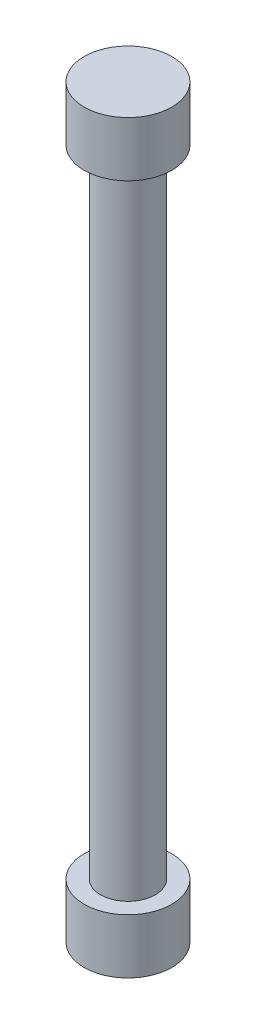
ISO-10303-21;
HEADER;
FILE_DESCRIPTION(('STEP AP214'),'2;1');
FILE_NAME('part.step','',(''),(''),'','','');
FILE_SCHEMA(('AUTOMOTIVE_DESIGN { 1 0 10303 214 1 1 1 1 }'));
ENDSEC;
DATA;
#1=APPLICATION_CONTEXT('core data for automotive mechanical design processes');
#2=APPLICATION_PROTOCOL_DEFINITION('international standard','automotive_design',2000,#1);
#3=PRODUCT_CONTEXT('',#1,'mechanical');
#4=PRODUCT('Part','Part','',(#3));
#5=PRODUCT_RELATED_PRODUCT_CATEGORY('part','',(#4));
#6=PRODUCT_DEFINITION_FORMATION('','',#4);
#7=PRODUCT_DEFINITION_CONTEXT('part definition',#1,'design');
#8=PRODUCT_DEFINITION('design','',#6,#7);
#9=PRODUCT_DEFINITION_SHAPE('','',#8);
#10=(LENGTH_UNIT() NAMED_UNIT(*) SI_UNIT(.MILLI.,.METRE.));
#11=(NAMED_UNIT(*) PLANE_ANGLE_UNIT() SI_UNIT($,.RADIAN.));
#12=(NAMED_UNIT(*) SI_UNIT($,.STERADIAN.) SOLID_ANGLE_UNIT());
#13=UNCERTAINTY_MEASURE_WITH_UNIT(LENGTH_MEASURE(1.E-05),#10,'distance_accuracy_value','');
#14=(GEOMETRIC_REPRESENTATION_CONTEXT(3) GLOBAL_UNCERTAINTY_ASSIGNED_CONTEXT((#13)) GLOBAL_UNIT_ASSIGNED_CONTEXT((#10,
#11,#12)) REPRESENTATION_CONTEXT('',''));
#15=CARTESIAN_POINT('',(0.,0.,0.));
#16=DIRECTION('',(0.,0.,1.));
#17=DIRECTION('',(1.,0.,0.));
#18=AXIS2_PLACEMENT_3D('',#15,#16,#17);
#19=CARTESIAN_POINT('',(0.,-58.,0.));
#20=DIRECTION('',(0.,1.,0.));
#21=DIRECTION('',(0.,0.,1.));
#22=AXIS2_PLACEMENT_3D('',#19,#20,#21);
#23=CYLINDRICAL_SURFACE('',#22,2.5);
#24=CARTESIAN_POINT('',(0.,-58.,0.));
#25=DIRECTION('',(0.,1.,0.));
#26=DIRECTION('',(0.,0.,1.));
#27=AXIS2_PLACEMENT_3D('',#24,#25,#26);
#28=CIRCLE('',#27,2.5);
#29=CARTESIAN_POINT('',(0.,-58.,2.5));
#30=VERTEX_POINT('',#29);
#31=EDGE_CURVE('E46',#30,#30,#28,.T.);
#32=CARTESIAN_POINT('',(0.,0.,0.));
#33=DIRECTION('',(0.,1.,0.));
#34=DIRECTION('',(0.,0.,1.));
#35=AXIS2_PLACEMENT_3D('',#32,#33,#34);
#36=CIRCLE('',#35,2.5);
#37=CARTESIAN_POINT('',(0.,0.,2.5));
#38=VERTEX_POINT('',#37);
#39=EDGE_CURVE('E10',#38,#38,#36,.T.);
#40=CARTESIAN_POINT('',(0.,-58.,2.5));
#41=CARTESIAN_POINT('',(0.,-57.3958333333333,2.5));
#42=CARTESIAN_POINT('',(0.,-56.7916666666667,2.5));
#43=CARTESIAN_POINT('',(0.,-55.5833333333333,2.5));
#44=CARTESIAN_POINT('',(0.,-54.9791666666667,2.5));
#45=CARTESIAN_POINT('',(0.,-53.7708333333333,2.5));
#46=CARTESIAN_POINT('',(0.,-53.1666666666667,2.5));
#47=CARTESIAN_POINT('',(0.,-51.9583333333333,2.5));
#48=CARTESIAN_POINT('',(0.,-51.3541666666667,2.5));
#49=CARTESIAN_POINT('',(0.,-50.1458333333333,2.5));
#50=CARTESIAN_POINT('',(0.,-49.5416666666667,2.5));
#51=CARTESIAN_POINT('',(0.,-48.3333333333333,2.5));
#52=CARTESIAN_POINT('',(0.,-47.7291666666667,2.5));
#53=CARTESIAN_POINT('',(0.,-46.5208333333333,2.5));
#54=CARTESIAN_POINT('',(0.,-45.9166666666667,2.5));
#55=CARTESIAN_POINT('',(0.,-44.7083333333333,2.5));
#56=CARTESIAN_POINT('',(0.,-44.1041666666667,2.5));
#57=CARTESIAN_POINT('',(0.,-42.8958333333333,2.5));
#58=CARTESIAN_POINT('',(0.,-42.2916666666667,2.5));
#59=CARTESIAN_POINT('',(0.,-41.0833333333333,2.5));
#60=CARTESIAN_POINT('',(0.,-40.4791666666667,2.5));
#61=CARTESIAN_POINT('',(0.,-39.2708333333333,2.5));
#62=CARTESIAN_POINT('',(0.,-38.6666666666667,2.5));
#63=CARTESIAN_POINT('',(0.,-37.4583333333333,2.5));
#64=CARTESIAN_POINT('',(0.,-36.8541666666667,2.5));
#65=CARTESIAN_POINT('',(0.,-35.6458333333333,2.5));
#66=CARTESIAN_POINT('',(0.,-35.0416666666667,2.5));
#67=CARTESIAN_POINT('',(0.,-33.8333333333333,2.5));
#68=CARTESIAN_POINT('',(0.,-33.2291666666667,2.5));
#69=CARTESIAN_POINT('',(0.,-32.0208333333333,2.5));
#70=CARTESIAN_POINT('',(0.,-31.4166666666667,2.5));
#71=CARTESIAN_POINT('',(0.,-30.2083333333333,2.5));
#72=CARTESIAN_POINT('',(0.,-29.6041666666667,2.5));
#73=CARTESIAN_POINT('',(0.,-28.3958333333333,2.5));
#74=CARTESIAN_POINT('',(0.,-27.7916666666667,2.5));
#75=CARTESIAN_POINT('',(0.,-26.5833333333333,2.5));
#76=CARTESIAN_POINT('',(0.,-25.9791666666667,2.5));
#77=CARTESIAN_POINT('',(0.,-24.7708333333333,2.5));
#78=CARTESIAN_POINT('',(0.,-24.1666666666667,2.5));
#79=CARTESIAN_POINT('',(0.,-22.9583333333333,2.5));
#80=CARTESIAN_POINT('',(0.,-22.3541666666667,2.5));
#81=CARTESIAN_POINT('',(0.,-21.1458333333333,2.5));
#82=CARTESIAN_POINT('',(0.,-20.5416666666667,2.5));
#83=CARTESIAN_POINT('',(0.,-19.3333333333333,2.5));
#84=CARTESIAN_POINT('',(0.,-18.7291666666667,2.5));
#85=CARTESIAN_POINT('',(0.,-17.5208333333333,2.5));
#86=CARTESIAN_POINT('',(0.,-16.9166666666667,2.5));
#87=CARTESIAN_POINT('',(0.,-15.7083333333333,2.5));
#88=CARTESIAN_POINT('',(0.,-15.1041666666667,2.5));
#89=CARTESIAN_POINT('',(0.,-13.8958333333333,2.5));
#90=CARTESIAN_POINT('',(0.,-13.2916666666667,2.5));
#91=CARTESIAN_POINT('',(0.,-12.0833333333333,2.5));
#92=CARTESIAN_POINT('',(0.,-11.4791666666667,2.5));
#93=CARTESIAN_POINT('',(0.,-10.2708333333333,2.5));
#94=CARTESIAN_POINT('',(0.,-9.66666666666667,2.5));
#95=CARTESIAN_POINT('',(0.,-8.45833333333333,2.5));
#96=CARTESIAN_POINT('',(0.,-7.85416666666667,2.5));
#97=CARTESIAN_POINT('',(0.,-6.64583333333333,2.5));
#98=CARTESIAN_POINT('',(0.,-6.04166666666667,2.5));
#99=CARTESIAN_POINT('',(0.,-4.83333333333334,2.5));
#100=CARTESIAN_POINT('',(0.,-4.22916666666667,2.5));
#101=CARTESIAN_POINT('',(0.,-3.02083333333334,2.5));
#102=CARTESIAN_POINT('',(0.,-2.41666666666667,2.5));
#103=CARTESIAN_POINT('',(0.,-1.20833333333333,2.5));
#104=CARTESIAN_POINT('',(0.,-0.604166666666667,2.5));
#105=CARTESIAN_POINT('',(0.,0.,2.5));
#106=B_SPLINE_CURVE_WITH_KNOTS('',3,(#40,#41,#42,#43,#44,#45,#46,#47,#48,#49,#50,#51,#52,#53,
#54,#55,#56,#57,#58,#59,#60,#61,#62,#63,#64,#65,#66,#67,#68,#69,#70,#71,#72,#73,#74,#75,#76,#77,
#78,#79,#80,#81,#82,#83,#84,#85,#86,#87,#88,#89,#90,#91,#92,#93,#94,#95,#96,#97,#98,#99,#100,
#101,#102,#103,#104,#105),.UNSPECIFIED.,.F.,.F.,(4,2,2,2,2,2,2,2,2,2,2,2,2,2,2,2,2,2,2,2,2,2,2,
2,2,2,2,2,2,2,2,2,4),(0.,1.8125,3.625,5.4375,7.25000000000001,9.0625,10.875,12.6875,14.5,
16.3125,18.125,19.9375,21.75,23.5625,25.375,27.1875,29.,30.8125,32.625,34.4375,36.25,38.0625,
39.875,41.6875,43.5,45.3125,47.125,48.9375,50.75,52.5625,54.375,56.1875,58.),.UNSPECIFIED.);
#107=EDGE_CURVE('BSEAM31',#30,#38,#106,.T.);
#108=ORIENTED_EDGE('',*,*,#31,.T.);
#109=ORIENTED_EDGE('',*,*,#39,.F.);
#110=ORIENTED_EDGE('',*,*,#107,.T.);
#111=ORIENTED_EDGE('',*,*,#107,.F.);
#112=EDGE_LOOP('',(#108,#110,#109,#111));
#113=FACE_BOUND('',#112,.T.);
#114=ADVANCED_FACE('F31',(#113),#23,.T.);
#115=CARTESIAN_POINT('',(0.,5.,0.));
#116=DIRECTION('',(0.,-1.,0.));
#117=DIRECTION('',(0.,0.,-1.));
#118=AXIS2_PLACEMENT_3D('',#115,#116,#117);
#119=CYLINDRICAL_SURFACE('',#118,4.);
#120=CARTESIAN_POINT('',(0.,5.,0.));
#121=DIRECTION('',(0.,1.,0.));
#122=DIRECTION('',(0.,0.,1.));
#123=AXIS2_PLACEMENT_3D('',#120,#121,#122);
#124=CIRCLE('',#123,4.);
#125=CARTESIAN_POINT('',(0.,5.,4.));
#126=VERTEX_POINT('',#125);
#127=EDGE_CURVE('E37',#126,#126,#124,.T.);
#128=ORIENTED_EDGE('',*,*,#127,.F.);
#129=EDGE_LOOP('',(#128));
#130=FACE_BOUND('',#129,.T.);
#131=CARTESIAN_POINT('',(0.,0.,0.));
#132=DIRECTION('',(0.,1.,0.));
#133=DIRECTION('',(0.,0.,1.));
#134=AXIS2_PLACEMENT_3D('',#131,#132,#133);
#135=CIRCLE('',#134,4.);
#136=CARTESIAN_POINT('',(0.,0.,4.));
#137=VERTEX_POINT('',#136);
#138=EDGE_CURVE('E41',#137,#137,#135,.T.);
#139=ORIENTED_EDGE('',*,*,#138,.T.);
#140=EDGE_LOOP('',(#139));
#141=FACE_BOUND('',#140,.T.);
#142=ADVANCED_FACE('F79',(#130,#141),#119,.T.);
#143=CARTESIAN_POINT('',(0.,5.,0.));
#144=DIRECTION('',(0.,1.,0.));
#145=DIRECTION('',(0.,0.,1.));
#146=AXIS2_PLACEMENT_3D('',#143,#144,#145);
#147=PLANE('',#146);
#148=ORIENTED_EDGE('',*,*,#127,.T.);
#149=EDGE_LOOP('',(#148));
#150=FACE_BOUND('',#149,.T.);
#151=ADVANCED_FACE('F74',(#150),#147,.T.);
#152=CARTESIAN_POINT('',(0.,0.,0.));
#153=DIRECTION('',(0.,1.,0.));
#154=DIRECTION('',(0.,0.,1.));
#155=AXIS2_PLACEMENT_3D('',#152,#153,#154);
#156=PLANE('',#155);
#157=ORIENTED_EDGE('',*,*,#39,.T.);
#158=EDGE_LOOP('',(#157));
#159=FACE_BOUND('',#158,.T.);
#160=ORIENTED_EDGE('',*,*,#138,.F.);
#161=EDGE_LOOP('',(#160));
#162=FACE_BOUND('',#161,.T.);
#163=ADVANCED_FACE('F66',(#159,#162),#156,.F.);
#164=CARTESIAN_POINT('',(0.,-63.,0.));
#165=DIRECTION('',(0.,1.,0.));
#166=DIRECTION('',(0.,0.,1.));
#167=AXIS2_PLACEMENT_3D('',#164,#165,#166);
#168=CYLINDRICAL_SURFACE('',#167,4.);
#169=CARTESIAN_POINT('',(0.,-63.,0.));
#170=DIRECTION('',(0.,1.,0.));
#171=DIRECTION('',(0.,0.,1.));
#172=AXIS2_PLACEMENT_3D('',#169,#170,#171);
#173=CIRCLE('',#172,4.);
#174=CARTESIAN_POINT('',(0.,-63.,4.));
#175=VERTEX_POINT('',#174);
#176=EDGE_CURVE('E52',#175,#175,#173,.T.);
#177=ORIENTED_EDGE('',*,*,#176,.T.);
#178=EDGE_LOOP('',(#177));
#179=FACE_BOUND('',#178,.T.);
#180=CARTESIAN_POINT('',(0.,-58.,0.));
#181=DIRECTION('',(0.,1.,0.));
#182=DIRECTION('',(0.,0.,1.));
#183=AXIS2_PLACEMENT_3D('',#180,#181,#182);
#184=CIRCLE('',#183,4.);
#185=CARTESIAN_POINT('',(0.,-58.,4.));
#186=VERTEX_POINT('',#185);
#187=EDGE_CURVE('E49',#186,#186,#184,.T.);
#188=ORIENTED_EDGE('',*,*,#187,.F.);
#189=EDGE_LOOP('',(#188));
#190=FACE_BOUND('',#189,.T.);
#191=ADVANCED_FACE('F63',(#179,#190),#168,.T.);
#192=CARTESIAN_POINT('',(0.,-63.,0.));
#193=DIRECTION('',(0.,1.,0.));
#194=DIRECTION('',(0.,0.,1.));
#195=AXIS2_PLACEMENT_3D('',#192,#193,#194);
#196=PLANE('',#195);
#197=ORIENTED_EDGE('',*,*,#176,.F.);
#198=EDGE_LOOP('',(#197));
#199=FACE_BOUND('',#198,.T.);
#200=ADVANCED_FACE('F65',(#199),#196,.F.);
#201=CARTESIAN_POINT('',(0.,-58.,0.));
#202=DIRECTION('',(0.,1.,0.));
#203=DIRECTION('',(0.,0.,1.));
#204=AXIS2_PLACEMENT_3D('',#201,#202,#203);
#205=PLANE('',#204);
#206=ORIENTED_EDGE('',*,*,#31,.F.);
#207=EDGE_LOOP('',(#206));
#208=FACE_BOUND('',#207,.T.);
#209=ORIENTED_EDGE('',*,*,#187,.T.);
#210=EDGE_LOOP('',(#209));
#211=FACE_BOUND('',#210,.T.);
#212=ADVANCED_FACE('F61',(#208,#211),#205,.T.);
#213=CLOSED_SHELL('',(#114,#142,#151,#163,#191,#200,#212));
#214=MANIFOLD_SOLID_BREP('B2',#213);
#215=ADVANCED_BREP_SHAPE_REPRESENTATION('',(#18,#214),#14);
#216=SHAPE_DEFINITION_REPRESENTATION(#9,#215);
ENDSEC;
END-ISO-10303-21;
